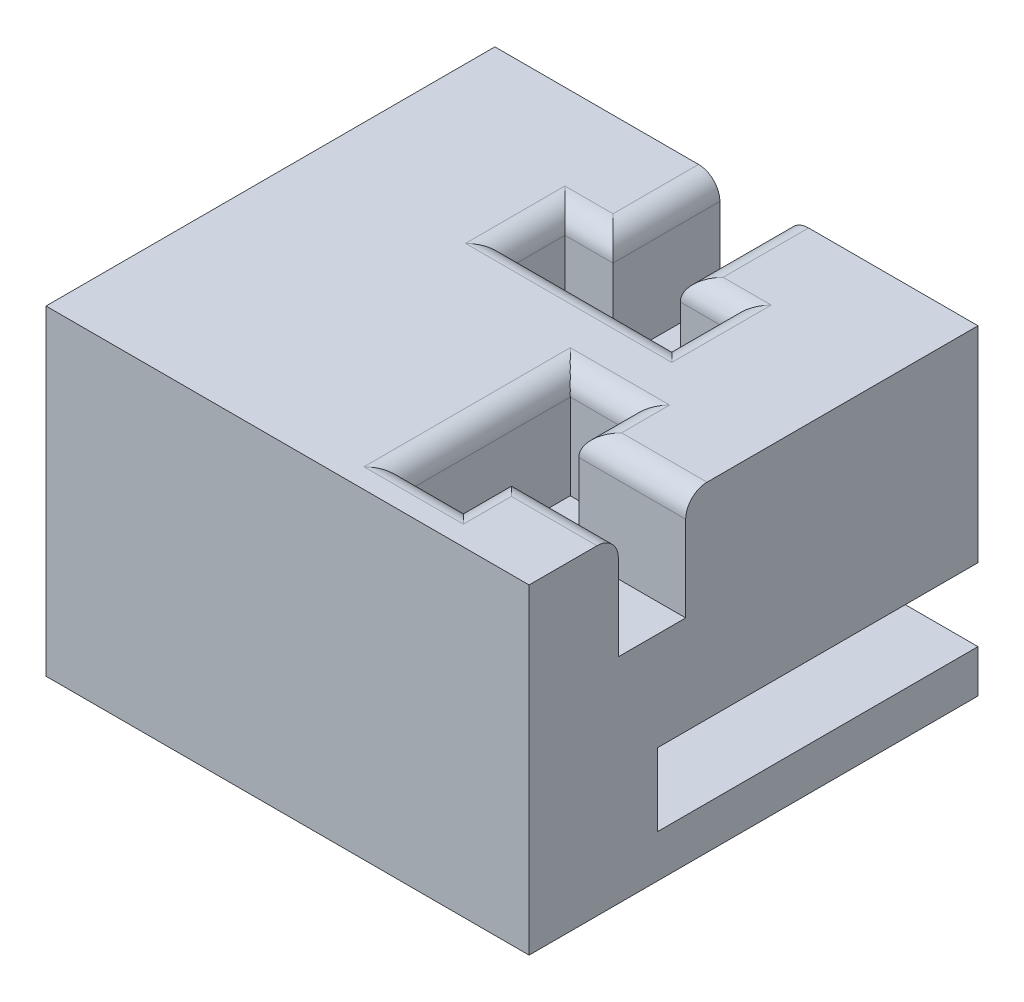
ISO-10303-21;
HEADER;
FILE_DESCRIPTION(('STEP AP214'),'2;1');
FILE_NAME('part.step','',(''),(''),'','','');
FILE_SCHEMA(('AUTOMOTIVE_DESIGN { 1 0 10303 214 1 1 1 1 }'));
ENDSEC;
DATA;
#1=APPLICATION_CONTEXT('core data for automotive mechanical design processes');
#2=APPLICATION_PROTOCOL_DEFINITION('international standard','automotive_design',2000,#1);
#3=PRODUCT_CONTEXT('',#1,'mechanical');
#4=PRODUCT('Part','Part','',(#3));
#5=PRODUCT_RELATED_PRODUCT_CATEGORY('part','',(#4));
#6=PRODUCT_DEFINITION_FORMATION('','',#4);
#7=PRODUCT_DEFINITION_CONTEXT('part definition',#1,'design');
#8=PRODUCT_DEFINITION('design','',#6,#7);
#9=PRODUCT_DEFINITION_SHAPE('','',#8);
#10=(LENGTH_UNIT() NAMED_UNIT(*) SI_UNIT(.MILLI.,.METRE.));
#11=(NAMED_UNIT(*) PLANE_ANGLE_UNIT() SI_UNIT($,.RADIAN.));
#12=(NAMED_UNIT(*) SI_UNIT($,.STERADIAN.) SOLID_ANGLE_UNIT());
#13=UNCERTAINTY_MEASURE_WITH_UNIT(LENGTH_MEASURE(1.E-05),#10,'distance_accuracy_value','');
#14=(GEOMETRIC_REPRESENTATION_CONTEXT(3) GLOBAL_UNCERTAINTY_ASSIGNED_CONTEXT((#13)) GLOBAL_UNIT_ASSIGNED_CONTEXT((#10,
#11,#12)) REPRESENTATION_CONTEXT('',''));
#15=CARTESIAN_POINT('',(0.,0.,0.));
#16=DIRECTION('',(0.,0.,1.));
#17=DIRECTION('',(1.,0.,0.));
#18=AXIS2_PLACEMENT_3D('',#15,#16,#17);
#19=CARTESIAN_POINT('',(-32.5,15.,-10.5));
#20=DIRECTION('',(0.,0.,1.));
#21=DIRECTION('',(-1.,0.,0.));
#22=AXIS2_PLACEMENT_3D('',#19,#20,#21);
#23=PLANE('',#22);
#24=DIRECTION('',(1.,0.,0.));
#25=VECTOR('',#24,1.);
#26=CARTESIAN_POINT('',(-32.5,0.,-10.5));
#27=LINE('',#26,#25);
#28=CARTESIAN_POINT('',(-55.1,0.,-10.5));
#29=VERTEX_POINT('',#28);
#30=CARTESIAN_POINT('',(-32.5,0.,-10.5));
#31=VERTEX_POINT('',#30);
#32=EDGE_CURVE('E280',#29,#31,#27,.T.);
#33=ORIENTED_EDGE('',*,*,#32,.F.);
#34=DIRECTION('',(0.,-1.,0.));
#35=VECTOR('',#34,1.);
#36=CARTESIAN_POINT('',(-55.1,0.,-10.5));
#37=LINE('',#36,#35);
#38=CARTESIAN_POINT('',(-55.1,2.,-10.5));
#39=VERTEX_POINT('',#38);
#40=EDGE_CURVE('E256',#39,#29,#37,.T.);
#41=ORIENTED_EDGE('',*,*,#40,.F.);
#42=DIRECTION('',(1.,0.,0.));
#43=VECTOR('',#42,1.);
#44=CARTESIAN_POINT('',(-72.8805071437843,2.,-10.5));
#45=LINE('',#44,#43);
#46=CARTESIAN_POINT('',(-32.5,2.,-10.5));
#47=VERTEX_POINT('',#46);
#48=EDGE_CURVE('E491',#39,#47,#45,.T.);
#49=ORIENTED_EDGE('',*,*,#48,.T.);
#50=DIRECTION('',(0.,-1.,0.));
#51=VECTOR('',#50,1.);
#52=CARTESIAN_POINT('',(-32.5,15.,-10.5));
#53=LINE('',#52,#51);
#54=EDGE_CURVE('E286',#47,#31,#53,.T.);
#55=ORIENTED_EDGE('',*,*,#54,.T.);
#56=EDGE_LOOP('',(#33,#41,#49,#55));
#57=FACE_BOUND('',#56,.T.);
#58=ADVANCED_FACE('F41',(#57),#23,.F.);
#59=DIRECTION('',(1.,0.,0.));
#60=VECTOR('',#59,1.);
#61=CARTESIAN_POINT('',(-72.8805071437843,5.4,-10.5));
#62=LINE('',#61,#60);
#63=CARTESIAN_POINT('',(-55.1,5.4,-10.5));
#64=VERTEX_POINT('',#63);
#65=CARTESIAN_POINT('',(-32.5,5.4,-10.5));
#66=VERTEX_POINT('',#65);
#67=EDGE_CURVE('E479',#64,#66,#62,.T.);
#68=ORIENTED_EDGE('',*,*,#67,.F.);
#69=CARTESIAN_POINT('',(-55.1,15.,-10.5));
#70=VERTEX_POINT('',#69);
#71=EDGE_CURVE('E269',#70,#64,#37,.T.);
#72=ORIENTED_EDGE('',*,*,#71,.F.);
#73=DIRECTION('',(1.,0.,0.));
#74=VECTOR('',#73,1.);
#75=CARTESIAN_POINT('',(-32.5,15.,-10.5));
#76=LINE('',#75,#74);
#77=CARTESIAN_POINT('',(-45.575,15.,-10.5));
#78=VERTEX_POINT('',#77);
#79=EDGE_CURVE('E278',#70,#78,#76,.T.);
#80=ORIENTED_EDGE('',*,*,#79,.T.);
#81=CARTESIAN_POINT('',(-45.575,14.,-10.5));
#82=DIRECTION('',(0.,0.,-1.));
#83=DIRECTION('',(-1.,0.,0.));
#84=AXIS2_PLACEMENT_3D('',#81,#82,#83);
#85=CIRCLE('',#84,1.);
#86=CARTESIAN_POINT('',(-44.575,14.,-10.5));
#87=VERTEX_POINT('',#86);
#88=EDGE_CURVE('E331',#87,#78,#85,.F.);
#89=ORIENTED_EDGE('',*,*,#88,.F.);
#90=DIRECTION('',(0.,1.,0.));
#91=VECTOR('',#90,1.);
#92=CARTESIAN_POINT('',(-44.575,10.,-10.5));
#93=LINE('',#92,#91);
#94=CARTESIAN_POINT('',(-44.575,10.,-10.5));
#95=VERTEX_POINT('',#94);
#96=EDGE_CURVE('E386',#95,#87,#93,.T.);
#97=ORIENTED_EDGE('',*,*,#96,.F.);
#98=DIRECTION('',(1.,0.,0.));
#99=VECTOR('',#98,1.);
#100=CARTESIAN_POINT('',(-44.575,10.,-10.5));
#101=LINE('',#100,#99);
#102=CARTESIAN_POINT('',(-41.425,10.,-10.5));
#103=VERTEX_POINT('',#102);
#104=EDGE_CURVE('E472',#95,#103,#101,.T.);
#105=ORIENTED_EDGE('',*,*,#104,.T.);
#106=DIRECTION('',(0.,1.,0.));
#107=VECTOR('',#106,1.);
#108=CARTESIAN_POINT('',(-41.425,10.,-10.5));
#109=LINE('',#108,#107);
#110=CARTESIAN_POINT('',(-41.425,14.,-10.5));
#111=VERTEX_POINT('',#110);
#112=EDGE_CURVE('E435',#103,#111,#109,.T.);
#113=ORIENTED_EDGE('',*,*,#112,.T.);
#114=CARTESIAN_POINT('',(-40.425,14.,-10.5));
#115=DIRECTION('',(0.,0.,-1.));
#116=DIRECTION('',(-1.,0.,0.));
#117=AXIS2_PLACEMENT_3D('',#114,#115,#116);
#118=CIRCLE('',#117,1.);
#119=CARTESIAN_POINT('',(-40.425,15.,-10.5));
#120=VERTEX_POINT('',#119);
#121=EDGE_CURVE('E334',#120,#111,#118,.F.);
#122=ORIENTED_EDGE('',*,*,#121,.F.);
#123=CARTESIAN_POINT('',(-32.5,15.,-10.5));
#124=VERTEX_POINT('',#123);
#125=EDGE_CURVE('E275',#120,#124,#76,.T.);
#126=ORIENTED_EDGE('',*,*,#125,.T.);
#127=EDGE_CURVE('E287',#124,#66,#53,.T.);
#128=ORIENTED_EDGE('',*,*,#127,.T.);
#129=EDGE_LOOP('',(#68,#72,#80,#89,#97,#105,#113,#122,#126,#128));
#130=FACE_BOUND('',#129,.T.);
#131=ADVANCED_FACE('F523',(#130),#23,.F.);
#132=CARTESIAN_POINT('',(-32.5,15.,-10.5));
#133=DIRECTION('',(-1.,0.,0.));
#134=DIRECTION('',(0.,0.,-1.));
#135=AXIS2_PLACEMENT_3D('',#132,#133,#134);
#136=PLANE('',#135);
#137=DIRECTION('',(0.,1.,0.));
#138=VECTOR('',#137,1.);
#139=CARTESIAN_POINT('',(-32.5,10.,3.175));
#140=LINE('',#139,#138);
#141=CARTESIAN_POINT('',(-32.5,10.,3.175));
#142=VERTEX_POINT('',#141);
#143=CARTESIAN_POINT('',(-32.5,14.,3.175));
#144=VERTEX_POINT('',#143);
#145=EDGE_CURVE('E419',#142,#144,#140,.T.);
#146=ORIENTED_EDGE('',*,*,#145,.F.);
#147=DIRECTION('',(0.,0.,1.));
#148=VECTOR('',#147,1.);
#149=CARTESIAN_POINT('',(-32.5,10.,6.325));
#150=LINE('',#149,#148);
#151=CARTESIAN_POINT('',(-32.5,10.,6.325));
#152=VERTEX_POINT('',#151);
#153=EDGE_CURVE('E416',#142,#152,#150,.T.);
#154=ORIENTED_EDGE('',*,*,#153,.T.);
#155=DIRECTION('',(0.,1.,0.));
#156=VECTOR('',#155,1.);
#157=CARTESIAN_POINT('',(-32.5,10.,6.325));
#158=LINE('',#157,#156);
#159=CARTESIAN_POINT('',(-32.5,14.,6.325));
#160=VERTEX_POINT('',#159);
#161=EDGE_CURVE('E414',#152,#160,#158,.T.);
#162=ORIENTED_EDGE('',*,*,#161,.T.);
#163=CARTESIAN_POINT('',(-32.5,14.,7.325));
#164=DIRECTION('',(1.,0.,0.));
#165=DIRECTION('',(0.,0.,-1.));
#166=AXIS2_PLACEMENT_3D('',#163,#164,#165);
#167=CIRCLE('',#166,1.);
#168=CARTESIAN_POINT('',(-32.5,15.,7.32499999999999));
#169=VERTEX_POINT('',#168);
#170=EDGE_CURVE('E356',#169,#160,#167,.F.);
#171=ORIENTED_EDGE('',*,*,#170,.F.);
#172=DIRECTION('',(0.,0.,1.));
#173=VECTOR('',#172,1.);
#174=CARTESIAN_POINT('',(-32.5,15.,-10.5));
#175=LINE('',#174,#173);
#176=CARTESIAN_POINT('',(-32.5,15.,10.5));
#177=VERTEX_POINT('',#176);
#178=EDGE_CURVE('E404',#169,#177,#175,.T.);
#179=ORIENTED_EDGE('',*,*,#178,.T.);
#180=DIRECTION('',(0.,-1.,0.));
#181=VECTOR('',#180,1.);
#182=CARTESIAN_POINT('',(-32.5,15.,10.5));
#183=LINE('',#182,#181);
#184=CARTESIAN_POINT('',(-32.5,0.,10.5));
#185=VERTEX_POINT('',#184);
#186=EDGE_CURVE('E284',#177,#185,#183,.T.);
#187=ORIENTED_EDGE('',*,*,#186,.T.);
#188=DIRECTION('',(0.,0.,1.));
#189=VECTOR('',#188,1.);
#190=CARTESIAN_POINT('',(-32.5,0.,-10.5));
#191=LINE('',#190,#189);
#192=EDGE_CURVE('E273',#31,#185,#191,.T.);
#193=ORIENTED_EDGE('',*,*,#192,.F.);
#194=ORIENTED_EDGE('',*,*,#54,.F.);
#195=DIRECTION('',(0.,0.,1.));
#196=VECTOR('',#195,1.);
#197=CARTESIAN_POINT('',(-32.5,2.,-10.5));
#198=LINE('',#197,#196);
#199=CARTESIAN_POINT('',(-32.5,2.,4.5));
#200=VERTEX_POINT('',#199);
#201=EDGE_CURVE('E482',#47,#200,#198,.T.);
#202=ORIENTED_EDGE('',*,*,#201,.T.);
#203=DIRECTION('',(0.,1.,0.));
#204=VECTOR('',#203,1.);
#205=CARTESIAN_POINT('',(-32.5,2.,4.5));
#206=LINE('',#205,#204);
#207=CARTESIAN_POINT('',(-32.5,5.4,4.5));
#208=VERTEX_POINT('',#207);
#209=EDGE_CURVE('E485',#200,#208,#206,.T.);
#210=ORIENTED_EDGE('',*,*,#209,.T.);
#211=DIRECTION('',(0.,0.,-1.));
#212=VECTOR('',#211,1.);
#213=CARTESIAN_POINT('',(-32.5,5.4,-10.5));
#214=LINE('',#213,#212);
#215=EDGE_CURVE('E489',#208,#66,#214,.T.);
#216=ORIENTED_EDGE('',*,*,#215,.T.);
#217=ORIENTED_EDGE('',*,*,#127,.F.);
#218=CARTESIAN_POINT('',(-32.5,15.,2.175));
#219=VERTEX_POINT('',#218);
#220=EDGE_CURVE('E407',#124,#219,#175,.T.);
#221=ORIENTED_EDGE('',*,*,#220,.T.);
#222=CARTESIAN_POINT('',(-32.5,14.,2.175));
#223=DIRECTION('',(1.,0.,0.));
#224=DIRECTION('',(0.,0.,-1.));
#225=AXIS2_PLACEMENT_3D('',#222,#223,#224);
#226=CIRCLE('',#225,1.);
#227=EDGE_CURVE('E359',#144,#219,#226,.F.);
#228=ORIENTED_EDGE('',*,*,#227,.F.);
#229=EDGE_LOOP('',(#146,#154,#162,#171,#179,#187,#193,#194,#202,#210,#216,#217,#221,#228));
#230=FACE_BOUND('',#229,.T.);
#231=ADVANCED_FACE('F411',(#230),#136,.F.);
#232=CARTESIAN_POINT('',(-32.5,15.,10.5));
#233=DIRECTION('',(0.,0.,-1.));
#234=DIRECTION('',(1.,0.,0.));
#235=AXIS2_PLACEMENT_3D('',#232,#233,#234);
#236=PLANE('',#235);
#237=DIRECTION('',(-1.,0.,0.));
#238=VECTOR('',#237,1.);
#239=CARTESIAN_POINT('',(-32.5,15.,10.5));
#240=LINE('',#239,#238);
#241=CARTESIAN_POINT('',(-55.1,15.,10.5));
#242=VERTEX_POINT('',#241);
#243=EDGE_CURVE('E268',#177,#242,#240,.T.);
#244=ORIENTED_EDGE('',*,*,#243,.T.);
#245=DIRECTION('',(0.,-1.,0.));
#246=VECTOR('',#245,1.);
#247=CARTESIAN_POINT('',(-55.1,0.,10.5));
#248=LINE('',#247,#246);
#249=CARTESIAN_POINT('',(-55.1,0.,10.5));
#250=VERTEX_POINT('',#249);
#251=EDGE_CURVE('E253',#242,#250,#248,.T.);
#252=ORIENTED_EDGE('',*,*,#251,.T.);
#253=DIRECTION('',(-1.,0.,0.));
#254=VECTOR('',#253,1.);
#255=CARTESIAN_POINT('',(-32.5,0.,10.5));
#256=LINE('',#255,#254);
#257=EDGE_CURVE('E266',#185,#250,#256,.T.);
#258=ORIENTED_EDGE('',*,*,#257,.F.);
#259=ORIENTED_EDGE('',*,*,#186,.F.);
#260=EDGE_LOOP('',(#244,#252,#258,#259));
#261=FACE_BOUND('',#260,.T.);
#262=ADVANCED_FACE('F264',(#261),#236,.F.);
#263=CARTESIAN_POINT('',(-45.,15.,0.));
#264=DIRECTION('',(0.,1.,0.));
#265=DIRECTION('',(0.,0.,1.));
#266=AXIS2_PLACEMENT_3D('',#263,#264,#265);
#267=PLANE('',#266);
#268=DIRECTION('',(0.,0.,-1.));
#269=VECTOR('',#268,1.);
#270=CARTESIAN_POINT('',(-55.1,15.,10.5));
#271=LINE('',#270,#269);
#272=EDGE_CURVE('E260',#242,#70,#271,.T.);
#273=ORIENTED_EDGE('',*,*,#272,.F.);
#274=ORIENTED_EDGE('',*,*,#243,.F.);
#275=ORIENTED_EDGE('',*,*,#178,.F.);
#276=DIRECTION('',(-1.,0.,0.));
#277=VECTOR('',#276,1.);
#278=CARTESIAN_POINT('',(-32.5,15.,7.325));
#279=LINE('',#278,#277);
#280=CARTESIAN_POINT('',(-36.5,15.,7.325));
#281=VERTEX_POINT('',#280);
#282=EDGE_CURVE('E293',#281,#169,#279,.F.);
#283=ORIENTED_EDGE('',*,*,#282,.F.);
#284=DIRECTION('',(0.,0.,1.));
#285=VECTOR('',#284,1.);
#286=CARTESIAN_POINT('',(-36.5,15.,6.325));
#287=LINE('',#286,#285);
#288=CARTESIAN_POINT('',(-36.5,15.,9.575));
#289=VERTEX_POINT('',#288);
#290=EDGE_CURVE('E295',#289,#281,#287,.F.);
#291=ORIENTED_EDGE('',*,*,#290,.F.);
#292=DIRECTION('',(-1.,0.,0.));
#293=VECTOR('',#292,1.);
#294=CARTESIAN_POINT('',(-37.5,15.,9.575));
#295=LINE('',#294,#293);
#296=CARTESIAN_POINT('',(-41.15,15.,9.575));
#297=VERTEX_POINT('',#296);
#298=EDGE_CURVE('E297',#297,#289,#295,.F.);
#299=ORIENTED_EDGE('',*,*,#298,.F.);
#300=DIRECTION('',(0.,0.,-1.));
#301=VECTOR('',#300,1.);
#302=CARTESIAN_POINT('',(-41.15,15.,8.575));
#303=LINE('',#302,#301);
#304=CARTESIAN_POINT('',(-41.15,15.,-0.0749999999999995));
#305=VERTEX_POINT('',#304);
#306=EDGE_CURVE('E299',#305,#297,#303,.F.);
#307=ORIENTED_EDGE('',*,*,#306,.F.);
#308=DIRECTION('',(1.,0.,0.));
#309=VECTOR('',#308,1.);
#310=CARTESIAN_POINT('',(-40.15,15.,-0.0749999999999995));
#311=LINE('',#310,#309);
#312=CARTESIAN_POINT('',(-36.5,15.,-0.0749999999999995));
#313=VERTEX_POINT('',#312);
#314=EDGE_CURVE('E302',#313,#305,#311,.F.);
#315=ORIENTED_EDGE('',*,*,#314,.F.);
#316=DIRECTION('',(0.,0.,1.));
#317=VECTOR('',#316,1.);
#318=CARTESIAN_POINT('',(-36.5,15.,0.925));
#319=LINE('',#318,#317);
#320=CARTESIAN_POINT('',(-36.5,15.,2.175));
#321=VERTEX_POINT('',#320);
#322=EDGE_CURVE('E305',#321,#313,#319,.F.);
#323=ORIENTED_EDGE('',*,*,#322,.F.);
#324=DIRECTION('',(1.,0.,0.));
#325=VECTOR('',#324,1.);
#326=CARTESIAN_POINT('',(-37.5,15.,2.175));
#327=LINE('',#326,#325);
#328=EDGE_CURVE('E308',#219,#321,#327,.F.);
#329=ORIENTED_EDGE('',*,*,#328,.F.);
#330=ORIENTED_EDGE('',*,*,#220,.F.);
#331=ORIENTED_EDGE('',*,*,#125,.F.);
#332=DIRECTION('',(0.,0.,1.));
#333=VECTOR('',#332,1.);
#334=CARTESIAN_POINT('',(-40.425,15.,-10.5));
#335=LINE('',#334,#333);
#336=CARTESIAN_POINT('',(-40.425,15.,-6.5));
#337=VERTEX_POINT('',#336);
#338=EDGE_CURVE('E329',#337,#120,#335,.F.);
#339=ORIENTED_EDGE('',*,*,#338,.F.);
#340=DIRECTION('',(1.,0.,0.));
#341=VECTOR('',#340,1.);
#342=CARTESIAN_POINT('',(-41.425,15.,-6.5));
#343=LINE('',#342,#341);
#344=CARTESIAN_POINT('',(-38.175,15.,-6.5));
#345=VERTEX_POINT('',#344);
#346=EDGE_CURVE('E326',#345,#337,#343,.F.);
#347=ORIENTED_EDGE('',*,*,#346,.F.);
#348=DIRECTION('',(0.,0.,1.));
#349=VECTOR('',#348,1.);
#350=CARTESIAN_POINT('',(-38.175,15.,-5.5));
#351=LINE('',#350,#349);
#352=CARTESIAN_POINT('',(-38.175,15.,-1.85));
#353=VERTEX_POINT('',#352);
#354=EDGE_CURVE('E323',#353,#345,#351,.F.);
#355=ORIENTED_EDGE('',*,*,#354,.F.);
#356=DIRECTION('',(-1.,0.,0.));
#357=VECTOR('',#356,1.);
#358=CARTESIAN_POINT('',(-39.175,15.,-1.85));
#359=LINE('',#358,#357);
#360=CARTESIAN_POINT('',(-47.825,15.,-1.85));
#361=VERTEX_POINT('',#360);
#362=EDGE_CURVE('E320',#361,#353,#359,.F.);
#363=ORIENTED_EDGE('',*,*,#362,.F.);
#364=DIRECTION('',(0.,0.,-1.));
#365=VECTOR('',#364,1.);
#366=CARTESIAN_POINT('',(-47.825,15.,-2.85));
#367=LINE('',#366,#365);
#368=CARTESIAN_POINT('',(-47.825,15.,-6.5));
#369=VERTEX_POINT('',#368);
#370=EDGE_CURVE('E317',#369,#361,#367,.F.);
#371=ORIENTED_EDGE('',*,*,#370,.F.);
#372=DIRECTION('',(1.,0.,0.));
#373=VECTOR('',#372,1.);
#374=CARTESIAN_POINT('',(-46.825,15.,-6.5));
#375=LINE('',#374,#373);
#376=CARTESIAN_POINT('',(-45.575,15.,-6.5));
#377=VERTEX_POINT('',#376);
#378=EDGE_CURVE('E314',#377,#369,#375,.F.);
#379=ORIENTED_EDGE('',*,*,#378,.F.);
#380=DIRECTION('',(0.,0.,-1.));
#381=VECTOR('',#380,1.);
#382=CARTESIAN_POINT('',(-45.575,15.,-5.5));
#383=LINE('',#382,#381);
#384=EDGE_CURVE('E311',#78,#377,#383,.F.);
#385=ORIENTED_EDGE('',*,*,#384,.F.);
#386=ORIENTED_EDGE('',*,*,#79,.F.);
#387=EDGE_LOOP('',(#273,#274,#275,#283,#291,#299,#307,#315,#323,#329,#330,#331,#339,#347,#355,
#363,#371,#379,#385,#386));
#388=FACE_BOUND('',#387,.T.);
#389=ADVANCED_FACE('F402',(#388),#267,.T.);
#390=CARTESIAN_POINT('',(-45.,0.,0.));
#391=DIRECTION('',(0.,1.,0.));
#392=DIRECTION('',(0.,0.,1.));
#393=AXIS2_PLACEMENT_3D('',#390,#391,#392);
#394=PLANE('',#393);
#395=ORIENTED_EDGE('',*,*,#257,.T.);
#396=DIRECTION('',(0.,0.,-1.));
#397=VECTOR('',#396,1.);
#398=CARTESIAN_POINT('',(-55.1,0.,10.5));
#399=LINE('',#398,#397);
#400=EDGE_CURVE('E250',#250,#29,#399,.T.);
#401=ORIENTED_EDGE('',*,*,#400,.T.);
#402=ORIENTED_EDGE('',*,*,#32,.T.);
#403=ORIENTED_EDGE('',*,*,#192,.T.);
#404=EDGE_LOOP('',(#395,#401,#402,#403));
#405=FACE_BOUND('',#404,.T.);
#406=ADVANCED_FACE('F271',(#405),#394,.F.);
#407=CARTESIAN_POINT('',(-72.8805071437843,5.4,-10.5));
#408=DIRECTION('',(0.,1.,0.));
#409=DIRECTION('',(0.,0.,1.));
#410=AXIS2_PLACEMENT_3D('',#407,#408,#409);
#411=PLANE('',#410);
#412=DIRECTION('',(0.,0.,1.));
#413=VECTOR('',#412,1.);
#414=CARTESIAN_POINT('',(-55.1,5.4,-10.5));
#415=LINE('',#414,#413);
#416=CARTESIAN_POINT('',(-55.1,5.4,4.5));
#417=VERTEX_POINT('',#416);
#418=EDGE_CURVE('E478',#64,#417,#415,.T.);
#419=ORIENTED_EDGE('',*,*,#418,.F.);
#420=ORIENTED_EDGE('',*,*,#67,.T.);
#421=ORIENTED_EDGE('',*,*,#215,.F.);
#422=DIRECTION('',(1.,0.,0.));
#423=VECTOR('',#422,1.);
#424=CARTESIAN_POINT('',(-72.8805071437843,5.4,4.5));
#425=LINE('',#424,#423);
#426=EDGE_CURVE('E494',#417,#208,#425,.T.);
#427=ORIENTED_EDGE('',*,*,#426,.F.);
#428=EDGE_LOOP('',(#419,#420,#421,#427));
#429=FACE_BOUND('',#428,.T.);
#430=ADVANCED_FACE('F519',(#429),#411,.F.);
#431=CARTESIAN_POINT('',(-72.8805071437843,2.,4.5));
#432=DIRECTION('',(0.,0.,1.));
#433=DIRECTION('',(0.,-1.,0.));
#434=AXIS2_PLACEMENT_3D('',#431,#432,#433);
#435=PLANE('',#434);
#436=DIRECTION('',(0.,-1.,0.));
#437=VECTOR('',#436,1.);
#438=CARTESIAN_POINT('',(-55.1,2.,4.5));
#439=LINE('',#438,#437);
#440=CARTESIAN_POINT('',(-55.1,2.,4.5));
#441=VERTEX_POINT('',#440);
#442=EDGE_CURVE('E476',#417,#441,#439,.T.);
#443=ORIENTED_EDGE('',*,*,#442,.F.);
#444=ORIENTED_EDGE('',*,*,#426,.T.);
#445=ORIENTED_EDGE('',*,*,#209,.F.);
#446=DIRECTION('',(1.,0.,0.));
#447=VECTOR('',#446,1.);
#448=CARTESIAN_POINT('',(-72.8805071437843,2.,4.5));
#449=LINE('',#448,#447);
#450=EDGE_CURVE('E496',#441,#200,#449,.T.);
#451=ORIENTED_EDGE('',*,*,#450,.F.);
#452=EDGE_LOOP('',(#443,#444,#445,#451));
#453=FACE_BOUND('',#452,.T.);
#454=ADVANCED_FACE('F515',(#453),#435,.F.);
#455=CARTESIAN_POINT('',(-72.8805071437843,2.,-10.5));
#456=DIRECTION('',(0.,-1.,0.));
#457=DIRECTION('',(0.,0.,-1.));
#458=AXIS2_PLACEMENT_3D('',#455,#456,#457);
#459=PLANE('',#458);
#460=DIRECTION('',(0.,0.,-1.));
#461=VECTOR('',#460,1.);
#462=CARTESIAN_POINT('',(-55.1,2.,-10.5));
#463=LINE('',#462,#461);
#464=EDGE_CURVE('E481',#441,#39,#463,.T.);
#465=ORIENTED_EDGE('',*,*,#464,.F.);
#466=ORIENTED_EDGE('',*,*,#450,.T.);
#467=ORIENTED_EDGE('',*,*,#201,.F.);
#468=ORIENTED_EDGE('',*,*,#48,.F.);
#469=EDGE_LOOP('',(#465,#466,#467,#468));
#470=FACE_BOUND('',#469,.T.);
#471=ADVANCED_FACE('F508',(#470),#459,.F.);
#472=CARTESIAN_POINT('',(-44.575,10.,-5.5));
#473=DIRECTION('',(-1.,0.,0.));
#474=DIRECTION('',(0.,0.,-1.));
#475=AXIS2_PLACEMENT_3D('',#472,#473,#474);
#476=PLANE('',#475);
#477=DIRECTION('',(0.,1.,0.));
#478=VECTOR('',#477,1.);
#479=CARTESIAN_POINT('',(-44.575,10.,-5.5));
#480=LINE('',#479,#478);
#481=CARTESIAN_POINT('',(-44.575,10.,-5.5));
#482=VERTEX_POINT('',#481);
#483=CARTESIAN_POINT('',(-44.575,14.,-5.5));
#484=VERTEX_POINT('',#483);
#485=EDGE_CURVE('E454',#482,#484,#480,.T.);
#486=ORIENTED_EDGE('',*,*,#485,.F.);
#487=DIRECTION('',(0.,0.,-1.));
#488=VECTOR('',#487,1.);
#489=CARTESIAN_POINT('',(-44.575,10.,-5.5));
#490=LINE('',#489,#488);
#491=EDGE_CURVE('E438',#482,#95,#490,.T.);
#492=ORIENTED_EDGE('',*,*,#491,.T.);
#493=ORIENTED_EDGE('',*,*,#96,.T.);
#494=DIRECTION('',(0.,0.,-1.));
#495=VECTOR('',#494,1.);
#496=CARTESIAN_POINT('',(-44.575,14.,-10.5));
#497=LINE('',#496,#495);
#498=EDGE_CURVE('E352',#484,#87,#497,.T.);
#499=ORIENTED_EDGE('',*,*,#498,.F.);
#500=EDGE_LOOP('',(#486,#492,#493,#499));
#501=FACE_BOUND('',#500,.T.);
#502=ADVANCED_FACE('F650',(#501),#476,.F.);
#503=CARTESIAN_POINT('',(-46.825,10.,-5.5));
#504=DIRECTION('',(0.,0.,-1.));
#505=DIRECTION('',(1.,0.,0.));
#506=AXIS2_PLACEMENT_3D('',#503,#504,#505);
#507=PLANE('',#506);
#508=DIRECTION('',(0.,1.,0.));
#509=VECTOR('',#508,1.);
#510=CARTESIAN_POINT('',(-46.825,10.,-5.5));
#511=LINE('',#510,#509);
#512=CARTESIAN_POINT('',(-46.825,10.,-5.5));
#513=VERTEX_POINT('',#512);
#514=CARTESIAN_POINT('',(-46.825,14.,-5.5));
#515=VERTEX_POINT('',#514);
#516=EDGE_CURVE('E451',#513,#515,#511,.T.);
#517=ORIENTED_EDGE('',*,*,#516,.F.);
#518=DIRECTION('',(1.,0.,0.));
#519=VECTOR('',#518,1.);
#520=CARTESIAN_POINT('',(-46.825,10.,-5.5));
#521=LINE('',#520,#519);
#522=EDGE_CURVE('E460',#513,#482,#521,.T.);
#523=ORIENTED_EDGE('',*,*,#522,.T.);
#524=ORIENTED_EDGE('',*,*,#485,.T.);
#525=DIRECTION('',(1.,0.,0.));
#526=VECTOR('',#525,1.);
#527=CARTESIAN_POINT('',(-44.575,14.,-5.5));
#528=LINE('',#527,#526);
#529=EDGE_CURVE('E349',#515,#484,#528,.T.);
#530=ORIENTED_EDGE('',*,*,#529,.F.);
#531=EDGE_LOOP('',(#517,#523,#524,#530));
#532=FACE_BOUND('',#531,.T.);
#533=ADVANCED_FACE('F651',(#532),#507,.F.);
#534=CARTESIAN_POINT('',(-46.825,10.,-2.85));
#535=DIRECTION('',(-1.,0.,0.));
#536=DIRECTION('',(0.,0.,-1.));
#537=AXIS2_PLACEMENT_3D('',#534,#535,#536);
#538=PLANE('',#537);
#539=DIRECTION('',(0.,1.,0.));
#540=VECTOR('',#539,1.);
#541=CARTESIAN_POINT('',(-46.825,10.,-2.85));
#542=LINE('',#541,#540);
#543=CARTESIAN_POINT('',(-46.825,10.,-2.85));
#544=VERTEX_POINT('',#543);
#545=CARTESIAN_POINT('',(-46.825,14.,-2.85));
#546=VERTEX_POINT('',#545);
#547=EDGE_CURVE('E448',#544,#546,#542,.T.);
#548=ORIENTED_EDGE('',*,*,#547,.F.);
#549=DIRECTION('',(0.,0.,-1.));
#550=VECTOR('',#549,1.);
#551=CARTESIAN_POINT('',(-46.825,10.,-2.85));
#552=LINE('',#551,#550);
#553=EDGE_CURVE('E462',#544,#513,#552,.T.);
#554=ORIENTED_EDGE('',*,*,#553,.T.);
#555=ORIENTED_EDGE('',*,*,#516,.T.);
#556=DIRECTION('',(0.,0.,-1.));
#557=VECTOR('',#556,1.);
#558=CARTESIAN_POINT('',(-46.825,14.,-5.5));
#559=LINE('',#558,#557);
#560=EDGE_CURVE('E346',#546,#515,#559,.T.);
#561=ORIENTED_EDGE('',*,*,#560,.F.);
#562=EDGE_LOOP('',(#548,#554,#555,#561));
#563=FACE_BOUND('',#562,.T.);
#564=ADVANCED_FACE('F671',(#563),#538,.F.);
#565=CARTESIAN_POINT('',(-39.175,10.,-2.85));
#566=DIRECTION('',(0.,0.,1.));
#567=DIRECTION('',(-1.,0.,0.));
#568=AXIS2_PLACEMENT_3D('',#565,#566,#567);
#569=PLANE('',#568);
#570=DIRECTION('',(0.,1.,0.));
#571=VECTOR('',#570,1.);
#572=CARTESIAN_POINT('',(-39.175,10.,-2.85));
#573=LINE('',#572,#571);
#574=CARTESIAN_POINT('',(-39.175,10.,-2.85));
#575=VERTEX_POINT('',#574);
#576=CARTESIAN_POINT('',(-39.175,14.,-2.85));
#577=VERTEX_POINT('',#576);
#578=EDGE_CURVE('E445',#575,#577,#573,.T.);
#579=ORIENTED_EDGE('',*,*,#578,.F.);
#580=DIRECTION('',(-1.,0.,0.));
#581=VECTOR('',#580,1.);
#582=CARTESIAN_POINT('',(-39.175,10.,-2.85));
#583=LINE('',#582,#581);
#584=EDGE_CURVE('E464',#575,#544,#583,.T.);
#585=ORIENTED_EDGE('',*,*,#584,.T.);
#586=ORIENTED_EDGE('',*,*,#547,.T.);
#587=DIRECTION('',(-1.,0.,0.));
#588=VECTOR('',#587,1.);
#589=CARTESIAN_POINT('',(-46.825,14.,-2.85));
#590=LINE('',#589,#588);
#591=EDGE_CURVE('E343',#577,#546,#590,.T.);
#592=ORIENTED_EDGE('',*,*,#591,.F.);
#593=EDGE_LOOP('',(#579,#585,#586,#592));
#594=FACE_BOUND('',#593,.T.);
#595=ADVANCED_FACE('F674',(#594),#569,.F.);
#596=CARTESIAN_POINT('',(-39.175,10.,-5.5));
#597=DIRECTION('',(1.,0.,0.));
#598=DIRECTION('',(0.,0.,1.));
#599=AXIS2_PLACEMENT_3D('',#596,#597,#598);
#600=PLANE('',#599);
#601=DIRECTION('',(0.,1.,0.));
#602=VECTOR('',#601,1.);
#603=CARTESIAN_POINT('',(-39.175,10.,-5.5));
#604=LINE('',#603,#602);
#605=CARTESIAN_POINT('',(-39.175,10.,-5.5));
#606=VERTEX_POINT('',#605);
#607=CARTESIAN_POINT('',(-39.175,14.,-5.5));
#608=VERTEX_POINT('',#607);
#609=EDGE_CURVE('E442',#606,#608,#604,.T.);
#610=ORIENTED_EDGE('',*,*,#609,.F.);
#611=DIRECTION('',(0.,0.,1.));
#612=VECTOR('',#611,1.);
#613=CARTESIAN_POINT('',(-39.175,10.,-5.5));
#614=LINE('',#613,#612);
#615=EDGE_CURVE('E466',#606,#575,#614,.T.);
#616=ORIENTED_EDGE('',*,*,#615,.T.);
#617=ORIENTED_EDGE('',*,*,#578,.T.);
#618=DIRECTION('',(0.,0.,1.));
#619=VECTOR('',#618,1.);
#620=CARTESIAN_POINT('',(-39.175,14.,-2.85));
#621=LINE('',#620,#619);
#622=EDGE_CURVE('E340',#608,#577,#621,.T.);
#623=ORIENTED_EDGE('',*,*,#622,.F.);
#624=EDGE_LOOP('',(#610,#616,#617,#623));
#625=FACE_BOUND('',#624,.T.);
#626=ADVANCED_FACE('F679',(#625),#600,.F.);
#627=CARTESIAN_POINT('',(-41.425,10.,-5.5));
#628=DIRECTION('',(0.,0.,-1.));
#629=DIRECTION('',(1.,0.,0.));
#630=AXIS2_PLACEMENT_3D('',#627,#628,#629);
#631=PLANE('',#630);
#632=DIRECTION('',(0.,1.,0.));
#633=VECTOR('',#632,1.);
#634=CARTESIAN_POINT('',(-41.425,10.,-5.5));
#635=LINE('',#634,#633);
#636=CARTESIAN_POINT('',(-41.425,10.,-5.5));
#637=VERTEX_POINT('',#636);
#638=CARTESIAN_POINT('',(-41.425,14.,-5.5));
#639=VERTEX_POINT('',#638);
#640=EDGE_CURVE('E439',#637,#639,#635,.T.);
#641=ORIENTED_EDGE('',*,*,#640,.F.);
#642=DIRECTION('',(1.,0.,0.));
#643=VECTOR('',#642,1.);
#644=CARTESIAN_POINT('',(-41.425,10.,-5.5));
#645=LINE('',#644,#643);
#646=EDGE_CURVE('E468',#637,#606,#645,.T.);
#647=ORIENTED_EDGE('',*,*,#646,.T.);
#648=ORIENTED_EDGE('',*,*,#609,.T.);
#649=DIRECTION('',(1.,0.,0.));
#650=VECTOR('',#649,1.);
#651=CARTESIAN_POINT('',(-39.175,14.,-5.5));
#652=LINE('',#651,#650);
#653=EDGE_CURVE('E337',#639,#608,#652,.T.);
#654=ORIENTED_EDGE('',*,*,#653,.F.);
#655=EDGE_LOOP('',(#641,#647,#648,#654));
#656=FACE_BOUND('',#655,.T.);
#657=ADVANCED_FACE('F681',(#656),#631,.F.);
#658=CARTESIAN_POINT('',(-41.425,10.,-10.5));
#659=DIRECTION('',(1.,0.,0.));
#660=DIRECTION('',(0.,0.,1.));
#661=AXIS2_PLACEMENT_3D('',#658,#659,#660);
#662=PLANE('',#661);
#663=ORIENTED_EDGE('',*,*,#112,.F.);
#664=DIRECTION('',(0.,0.,1.));
#665=VECTOR('',#664,1.);
#666=CARTESIAN_POINT('',(-41.425,10.,-10.5));
#667=LINE('',#666,#665);
#668=EDGE_CURVE('E470',#103,#637,#667,.T.);
#669=ORIENTED_EDGE('',*,*,#668,.T.);
#670=ORIENTED_EDGE('',*,*,#640,.T.);
#671=DIRECTION('',(0.,0.,1.));
#672=VECTOR('',#671,1.);
#673=CARTESIAN_POINT('',(-41.425,14.,-5.5));
#674=LINE('',#673,#672);
#675=EDGE_CURVE('E290',#111,#639,#674,.T.);
#676=ORIENTED_EDGE('',*,*,#675,.F.);
#677=EDGE_LOOP('',(#663,#669,#670,#676));
#678=FACE_BOUND('',#677,.T.);
#679=ADVANCED_FACE('F661',(#678),#662,.F.);
#680=CARTESIAN_POINT('',(-45.,10.,0.));
#681=DIRECTION('',(0.,1.,0.));
#682=DIRECTION('',(0.,0.,1.));
#683=AXIS2_PLACEMENT_3D('',#680,#681,#682);
#684=PLANE('',#683);
#685=ORIENTED_EDGE('',*,*,#104,.F.);
#686=ORIENTED_EDGE('',*,*,#491,.F.);
#687=ORIENTED_EDGE('',*,*,#522,.F.);
#688=ORIENTED_EDGE('',*,*,#553,.F.);
#689=ORIENTED_EDGE('',*,*,#584,.F.);
#690=ORIENTED_EDGE('',*,*,#615,.F.);
#691=ORIENTED_EDGE('',*,*,#646,.F.);
#692=ORIENTED_EDGE('',*,*,#668,.F.);
#693=EDGE_LOOP('',(#685,#686,#687,#688,#689,#690,#691,#692));
#694=FACE_BOUND('',#693,.T.);
#695=ADVANCED_FACE('F657',(#694),#684,.T.);
#696=CARTESIAN_POINT('',(-37.5,10.,0.925));
#697=DIRECTION('',(0.,0.,-1.));
#698=DIRECTION('',(1.,0.,0.));
#699=AXIS2_PLACEMENT_3D('',#696,#697,#698);
#700=PLANE('',#699);
#701=DIRECTION('',(0.,1.,0.));
#702=VECTOR('',#701,1.);
#703=CARTESIAN_POINT('',(-40.15,10.,0.925));
#704=LINE('',#703,#702);
#705=CARTESIAN_POINT('',(-40.15,10.,0.925));
#706=VERTEX_POINT('',#705);
#707=CARTESIAN_POINT('',(-40.15,14.,0.925));
#708=VERTEX_POINT('',#707);
#709=EDGE_CURVE('E486',#706,#708,#704,.T.);
#710=ORIENTED_EDGE('',*,*,#709,.F.);
#711=DIRECTION('',(1.,0.,0.));
#712=VECTOR('',#711,1.);
#713=CARTESIAN_POINT('',(-37.5,10.,0.925));
#714=LINE('',#713,#712);
#715=CARTESIAN_POINT('',(-37.5,10.,0.925));
#716=VERTEX_POINT('',#715);
#717=EDGE_CURVE('E475',#706,#716,#714,.T.);
#718=ORIENTED_EDGE('',*,*,#717,.T.);
#719=DIRECTION('',(0.,1.,0.));
#720=VECTOR('',#719,1.);
#721=CARTESIAN_POINT('',(-37.5,10.,0.925));
#722=LINE('',#721,#720);
#723=CARTESIAN_POINT('',(-37.5,14.,0.925));
#724=VERTEX_POINT('',#723);
#725=EDGE_CURVE('E431',#716,#724,#722,.T.);
#726=ORIENTED_EDGE('',*,*,#725,.T.);
#727=DIRECTION('',(1.,0.,0.));
#728=VECTOR('',#727,1.);
#729=CARTESIAN_POINT('',(-37.5,14.,0.925));
#730=LINE('',#729,#728);
#731=EDGE_CURVE('E365',#708,#724,#730,.T.);
#732=ORIENTED_EDGE('',*,*,#731,.F.);
#733=EDGE_LOOP('',(#710,#718,#726,#732));
#734=FACE_BOUND('',#733,.T.);
#735=ADVANCED_FACE('F584',(#734),#700,.F.);
#736=CARTESIAN_POINT('',(-40.15,10.,0.925));
#737=DIRECTION('',(-1.,0.,0.));
#738=DIRECTION('',(0.,0.,-1.));
#739=AXIS2_PLACEMENT_3D('',#736,#737,#738);
#740=PLANE('',#739);
#741=DIRECTION('',(0.,1.,0.));
#742=VECTOR('',#741,1.);
#743=CARTESIAN_POINT('',(-40.15,10.,8.575));
#744=LINE('',#743,#742);
#745=CARTESIAN_POINT('',(-40.15,10.,8.575));
#746=VERTEX_POINT('',#745);
#747=CARTESIAN_POINT('',(-40.15,14.,8.575));
#748=VERTEX_POINT('',#747);
#749=EDGE_CURVE('E561',#746,#748,#744,.T.);
#750=ORIENTED_EDGE('',*,*,#749,.F.);
#751=DIRECTION('',(0.,0.,-1.));
#752=VECTOR('',#751,1.);
#753=CARTESIAN_POINT('',(-40.15,10.,0.925));
#754=LINE('',#753,#752);
#755=EDGE_CURVE('E434',#746,#706,#754,.T.);
#756=ORIENTED_EDGE('',*,*,#755,.T.);
#757=ORIENTED_EDGE('',*,*,#709,.T.);
#758=DIRECTION('',(0.,0.,-1.));
#759=VECTOR('',#758,1.);
#760=CARTESIAN_POINT('',(-40.15,14.,0.925));
#761=LINE('',#760,#759);
#762=EDGE_CURVE('E368',#748,#708,#761,.T.);
#763=ORIENTED_EDGE('',*,*,#762,.F.);
#764=EDGE_LOOP('',(#750,#756,#757,#763));
#765=FACE_BOUND('',#764,.T.);
#766=ADVANCED_FACE('F578',(#765),#740,.F.);
#767=CARTESIAN_POINT('',(-40.15,10.,8.575));
#768=DIRECTION('',(0.,0.,1.));
#769=DIRECTION('',(-1.,0.,0.));
#770=AXIS2_PLACEMENT_3D('',#767,#768,#769);
#771=PLANE('',#770);
#772=DIRECTION('',(0.,1.,0.));
#773=VECTOR('',#772,1.);
#774=CARTESIAN_POINT('',(-37.5,10.,8.575));
#775=LINE('',#774,#773);
#776=CARTESIAN_POINT('',(-37.5,10.,8.575));
#777=VERTEX_POINT('',#776);
#778=CARTESIAN_POINT('',(-37.5,14.,8.575));
#779=VERTEX_POINT('',#778);
#780=EDGE_CURVE('E422',#777,#779,#775,.T.);
#781=ORIENTED_EDGE('',*,*,#780,.F.);
#782=DIRECTION('',(-1.,0.,0.));
#783=VECTOR('',#782,1.);
#784=CARTESIAN_POINT('',(-40.15,10.,8.575));
#785=LINE('',#784,#783);
#786=EDGE_CURVE('E556',#777,#746,#785,.T.);
#787=ORIENTED_EDGE('',*,*,#786,.T.);
#788=ORIENTED_EDGE('',*,*,#749,.T.);
#789=DIRECTION('',(-1.,0.,0.));
#790=VECTOR('',#789,1.);
#791=CARTESIAN_POINT('',(-40.15,14.,8.575));
#792=LINE('',#791,#790);
#793=EDGE_CURVE('E50',#779,#748,#792,.T.);
#794=ORIENTED_EDGE('',*,*,#793,.F.);
#795=EDGE_LOOP('',(#781,#787,#788,#794));
#796=FACE_BOUND('',#795,.T.);
#797=ADVANCED_FACE('F572',(#796),#771,.F.);
#798=CARTESIAN_POINT('',(-37.5,10.,8.575));
#799=DIRECTION('',(1.,0.,0.));
#800=DIRECTION('',(0.,0.,1.));
#801=AXIS2_PLACEMENT_3D('',#798,#799,#800);
#802=PLANE('',#801);
#803=DIRECTION('',(0.,1.,0.));
#804=VECTOR('',#803,1.);
#805=CARTESIAN_POINT('',(-37.5,10.,6.325));
#806=LINE('',#805,#804);
#807=CARTESIAN_POINT('',(-37.5,10.,6.325));
#808=VERTEX_POINT('',#807);
#809=CARTESIAN_POINT('',(-37.5,14.,6.325));
#810=VERTEX_POINT('',#809);
#811=EDGE_CURVE('E418',#808,#810,#806,.T.);
#812=ORIENTED_EDGE('',*,*,#811,.F.);
#813=DIRECTION('',(0.,0.,1.));
#814=VECTOR('',#813,1.);
#815=CARTESIAN_POINT('',(-37.5,10.,8.575));
#816=LINE('',#815,#814);
#817=EDGE_CURVE('E554',#808,#777,#816,.T.);
#818=ORIENTED_EDGE('',*,*,#817,.T.);
#819=ORIENTED_EDGE('',*,*,#780,.T.);
#820=DIRECTION('',(0.,0.,1.));
#821=VECTOR('',#820,1.);
#822=CARTESIAN_POINT('',(-37.5,14.,8.575));
#823=LINE('',#822,#821);
#824=EDGE_CURVE('E371',#810,#779,#823,.T.);
#825=ORIENTED_EDGE('',*,*,#824,.F.);
#826=EDGE_LOOP('',(#812,#818,#819,#825));
#827=FACE_BOUND('',#826,.T.);
#828=ADVANCED_FACE('F567',(#827),#802,.F.);
#829=CARTESIAN_POINT('',(-37.5,10.,6.325));
#830=DIRECTION('',(0.,0.,1.));
#831=DIRECTION('',(-1.,0.,0.));
#832=AXIS2_PLACEMENT_3D('',#829,#830,#831);
#833=PLANE('',#832);
#834=ORIENTED_EDGE('',*,*,#161,.F.);
#835=DIRECTION('',(-1.,0.,0.));
#836=VECTOR('',#835,1.);
#837=CARTESIAN_POINT('',(-37.5,10.,6.325));
#838=LINE('',#837,#836);
#839=EDGE_CURVE('E549',#152,#808,#838,.T.);
#840=ORIENTED_EDGE('',*,*,#839,.T.);
#841=ORIENTED_EDGE('',*,*,#811,.T.);
#842=DIRECTION('',(-1.,0.,0.));
#843=VECTOR('',#842,1.);
#844=CARTESIAN_POINT('',(-37.5,14.,6.325));
#845=LINE('',#844,#843);
#846=EDGE_CURVE('E12',#160,#810,#845,.T.);
#847=ORIENTED_EDGE('',*,*,#846,.F.);
#848=EDGE_LOOP('',(#834,#840,#841,#847));
#849=FACE_BOUND('',#848,.T.);
#850=ADVANCED_FACE('F795',(#849),#833,.F.);
#851=CARTESIAN_POINT('',(-32.5,10.,3.175));
#852=DIRECTION('',(0.,0.,-1.));
#853=DIRECTION('',(1.,0.,0.));
#854=AXIS2_PLACEMENT_3D('',#851,#852,#853);
#855=PLANE('',#854);
#856=DIRECTION('',(0.,1.,0.));
#857=VECTOR('',#856,1.);
#858=CARTESIAN_POINT('',(-37.5,10.,3.175));
#859=LINE('',#858,#857);
#860=CARTESIAN_POINT('',(-37.5,10.,3.175));
#861=VERTEX_POINT('',#860);
#862=CARTESIAN_POINT('',(-37.5,14.,3.175));
#863=VERTEX_POINT('',#862);
#864=EDGE_CURVE('E425',#861,#863,#859,.T.);
#865=ORIENTED_EDGE('',*,*,#864,.F.);
#866=DIRECTION('',(1.,0.,0.));
#867=VECTOR('',#866,1.);
#868=CARTESIAN_POINT('',(-32.5,10.,3.175));
#869=LINE('',#868,#867);
#870=EDGE_CURVE('E545',#861,#142,#869,.T.);
#871=ORIENTED_EDGE('',*,*,#870,.T.);
#872=ORIENTED_EDGE('',*,*,#145,.T.);
#873=DIRECTION('',(1.,0.,0.));
#874=VECTOR('',#873,1.);
#875=CARTESIAN_POINT('',(-32.5,14.,3.175));
#876=LINE('',#875,#874);
#877=EDGE_CURVE('E354',#863,#144,#876,.T.);
#878=ORIENTED_EDGE('',*,*,#877,.F.);
#879=EDGE_LOOP('',(#865,#871,#872,#878));
#880=FACE_BOUND('',#879,.T.);
#881=ADVANCED_FACE('F535',(#880),#855,.F.);
#882=CARTESIAN_POINT('',(-37.5,10.,3.175));
#883=DIRECTION('',(1.,0.,0.));
#884=DIRECTION('',(0.,0.,1.));
#885=AXIS2_PLACEMENT_3D('',#882,#883,#884);
#886=PLANE('',#885);
#887=ORIENTED_EDGE('',*,*,#725,.F.);
#888=DIRECTION('',(0.,0.,1.));
#889=VECTOR('',#888,1.);
#890=CARTESIAN_POINT('',(-37.5,10.,3.175));
#891=LINE('',#890,#889);
#892=EDGE_CURVE('E540',#716,#861,#891,.T.);
#893=ORIENTED_EDGE('',*,*,#892,.T.);
#894=ORIENTED_EDGE('',*,*,#864,.T.);
#895=DIRECTION('',(0.,0.,1.));
#896=VECTOR('',#895,1.);
#897=CARTESIAN_POINT('',(-37.5,14.,3.175));
#898=LINE('',#897,#896);
#899=EDGE_CURVE('E362',#724,#863,#898,.T.);
#900=ORIENTED_EDGE('',*,*,#899,.F.);
#901=EDGE_LOOP('',(#887,#893,#894,#900));
#902=FACE_BOUND('',#901,.T.);
#903=ADVANCED_FACE('F539',(#902),#886,.F.);
#904=CARTESIAN_POINT('',(-45.,10.,0.));
#905=DIRECTION('',(0.,-1.,0.));
#906=DIRECTION('',(0.,0.,-1.));
#907=AXIS2_PLACEMENT_3D('',#904,#905,#906);
#908=PLANE('',#907);
#909=ORIENTED_EDGE('',*,*,#717,.F.);
#910=ORIENTED_EDGE('',*,*,#755,.F.);
#911=ORIENTED_EDGE('',*,*,#786,.F.);
#912=ORIENTED_EDGE('',*,*,#817,.F.);
#913=ORIENTED_EDGE('',*,*,#839,.F.);
#914=ORIENTED_EDGE('',*,*,#153,.F.);
#915=ORIENTED_EDGE('',*,*,#870,.F.);
#916=ORIENTED_EDGE('',*,*,#892,.F.);
#917=EDGE_LOOP('',(#909,#910,#911,#912,#913,#914,#915,#916));
#918=FACE_BOUND('',#917,.T.);
#919=ADVANCED_FACE('F547',(#918),#908,.F.);
#920=CARTESIAN_POINT('',(-45.575,14.,-5.5));
#921=DIRECTION('',(0.,0.,1.));
#922=DIRECTION('',(-1.,0.,0.));
#923=AXIS2_PLACEMENT_3D('',#920,#921,#922);
#924=CYLINDRICAL_SURFACE('',#923,1.);
#925=ORIENTED_EDGE('',*,*,#88,.T.);
#926=ORIENTED_EDGE('',*,*,#384,.T.);
#927=CARTESIAN_POINT('',(-45.575,14.,-6.5));
#928=DIRECTION('',(0.707106781186548,0.,-0.707106781186547));
#929=DIRECTION('',(0.707106781186547,0.,0.707106781186548));
#930=AXIS2_PLACEMENT_3D('',#927,#928,#929);
#931=ELLIPSE('',#930,1.41421356237309,1.);
#932=EDGE_CURVE('E384',#377,#484,#931,.T.);
#933=ORIENTED_EDGE('',*,*,#932,.T.);
#934=ORIENTED_EDGE('',*,*,#498,.T.);
#935=EDGE_LOOP('',(#925,#926,#933,#934));
#936=FACE_BOUND('',#935,.T.);
#937=ADVANCED_FACE('F629',(#936),#924,.T.);
#938=CARTESIAN_POINT('',(-46.825,14.,-6.5));
#939=DIRECTION('',(-1.,0.,0.));
#940=DIRECTION('',(0.,0.,-1.));
#941=AXIS2_PLACEMENT_3D('',#938,#939,#940);
#942=CYLINDRICAL_SURFACE('',#941,1.);
#943=ORIENTED_EDGE('',*,*,#932,.F.);
#944=ORIENTED_EDGE('',*,*,#378,.T.);
#945=CARTESIAN_POINT('',(-47.825,14.,-6.5));
#946=DIRECTION('',(0.707106781186547,0.,-0.707106781186547));
#947=DIRECTION('',(0.707106781186547,0.,0.707106781186547));
#948=AXIS2_PLACEMENT_3D('',#945,#946,#947);
#949=ELLIPSE('',#948,1.41421356237309,1.);
#950=EDGE_CURVE('E382',#369,#515,#949,.T.);
#951=ORIENTED_EDGE('',*,*,#950,.T.);
#952=ORIENTED_EDGE('',*,*,#529,.T.);
#953=EDGE_LOOP('',(#943,#944,#951,#952));
#954=FACE_BOUND('',#953,.T.);
#955=ADVANCED_FACE('F625',(#954),#942,.T.);
#956=CARTESIAN_POINT('',(-47.825,14.,-2.85));
#957=DIRECTION('',(0.,0.,1.));
#958=DIRECTION('',(-1.,0.,0.));
#959=AXIS2_PLACEMENT_3D('',#956,#957,#958);
#960=CYLINDRICAL_SURFACE('',#959,1.);
#961=ORIENTED_EDGE('',*,*,#950,.F.);
#962=ORIENTED_EDGE('',*,*,#370,.T.);
#963=CARTESIAN_POINT('',(-47.825,14.,-1.85));
#964=DIRECTION('',(-0.707106781186547,0.,-0.707106781186548));
#965=DIRECTION('',(0.707106781186548,0.,-0.707106781186547));
#966=AXIS2_PLACEMENT_3D('',#963,#964,#965);
#967=ELLIPSE('',#966,1.41421356237309,1.);
#968=EDGE_CURVE('E380',#361,#546,#967,.T.);
#969=ORIENTED_EDGE('',*,*,#968,.T.);
#970=ORIENTED_EDGE('',*,*,#560,.T.);
#971=EDGE_LOOP('',(#961,#962,#969,#970));
#972=FACE_BOUND('',#971,.T.);
#973=ADVANCED_FACE('F621',(#972),#960,.T.);
#974=CARTESIAN_POINT('',(-39.175,14.,-1.85));
#975=DIRECTION('',(1.,0.,0.));
#976=DIRECTION('',(0.,0.,1.));
#977=AXIS2_PLACEMENT_3D('',#974,#975,#976);
#978=CYLINDRICAL_SURFACE('',#977,1.);
#979=ORIENTED_EDGE('',*,*,#968,.F.);
#980=ORIENTED_EDGE('',*,*,#362,.T.);
#981=CARTESIAN_POINT('',(-38.175,14.,-1.85));
#982=DIRECTION('',(-0.707106781186548,0.,0.707106781186547));
#983=DIRECTION('',(-0.707106781186547,0.,-0.707106781186548));
#984=AXIS2_PLACEMENT_3D('',#981,#982,#983);
#985=ELLIPSE('',#984,1.41421356237309,1.);
#986=EDGE_CURVE('E378',#353,#577,#985,.T.);
#987=ORIENTED_EDGE('',*,*,#986,.T.);
#988=ORIENTED_EDGE('',*,*,#591,.T.);
#989=EDGE_LOOP('',(#979,#980,#987,#988));
#990=FACE_BOUND('',#989,.T.);
#991=ADVANCED_FACE('F617',(#990),#978,.T.);
#992=CARTESIAN_POINT('',(-38.175,14.,-5.5));
#993=DIRECTION('',(0.,0.,-1.));
#994=DIRECTION('',(1.,0.,0.));
#995=AXIS2_PLACEMENT_3D('',#992,#993,#994);
#996=CYLINDRICAL_SURFACE('',#995,1.);
#997=ORIENTED_EDGE('',*,*,#986,.F.);
#998=ORIENTED_EDGE('',*,*,#354,.T.);
#999=CARTESIAN_POINT('',(-38.175,14.,-6.5));
#1000=DIRECTION('',(0.707106781186547,0.,0.707106781186548));
#1001=DIRECTION('',(-0.707106781186548,0.,0.707106781186547));
#1002=AXIS2_PLACEMENT_3D('',#999,#1000,#1001);
#1003=ELLIPSE('',#1002,1.41421356237309,1.);
#1004=EDGE_CURVE('E376',#345,#608,#1003,.T.);
#1005=ORIENTED_EDGE('',*,*,#1004,.T.);
#1006=ORIENTED_EDGE('',*,*,#622,.T.);
#1007=EDGE_LOOP('',(#997,#998,#1005,#1006));
#1008=FACE_BOUND('',#1007,.T.);
#1009=ADVANCED_FACE('F613',(#1008),#996,.T.);
#1010=CARTESIAN_POINT('',(-41.425,14.,-6.5));
#1011=DIRECTION('',(-1.,0.,0.));
#1012=DIRECTION('',(0.,0.,-1.));
#1013=AXIS2_PLACEMENT_3D('',#1010,#1011,#1012);
#1014=CYLINDRICAL_SURFACE('',#1013,1.);
#1015=ORIENTED_EDGE('',*,*,#1004,.F.);
#1016=ORIENTED_EDGE('',*,*,#346,.T.);
#1017=CARTESIAN_POINT('',(-40.425,14.,-6.5));
#1018=DIRECTION('',(0.707106781186547,0.,0.707106781186548));
#1019=DIRECTION('',(-0.707106781186548,0.,0.707106781186547));
#1020=AXIS2_PLACEMENT_3D('',#1017,#1018,#1019);
#1021=ELLIPSE('',#1020,1.41421356237309,1.);
#1022=EDGE_CURVE('E374',#337,#639,#1021,.T.);
#1023=ORIENTED_EDGE('',*,*,#1022,.T.);
#1024=ORIENTED_EDGE('',*,*,#653,.T.);
#1025=EDGE_LOOP('',(#1015,#1016,#1023,#1024));
#1026=FACE_BOUND('',#1025,.T.);
#1027=ADVANCED_FACE('F609',(#1026),#1014,.T.);
#1028=CARTESIAN_POINT('',(-40.425,14.,-10.5));
#1029=DIRECTION('',(0.,0.,-1.));
#1030=DIRECTION('',(1.,0.,0.));
#1031=AXIS2_PLACEMENT_3D('',#1028,#1029,#1030);
#1032=CYLINDRICAL_SURFACE('',#1031,1.);
#1033=ORIENTED_EDGE('',*,*,#121,.T.);
#1034=ORIENTED_EDGE('',*,*,#675,.T.);
#1035=ORIENTED_EDGE('',*,*,#1022,.F.);
#1036=ORIENTED_EDGE('',*,*,#338,.T.);
#1037=EDGE_LOOP('',(#1033,#1034,#1035,#1036));
#1038=FACE_BOUND('',#1037,.T.);
#1039=ADVANCED_FACE('F606',(#1038),#1032,.T.);
#1040=CARTESIAN_POINT('',(-37.5,14.,7.325));
#1041=DIRECTION('',(1.,0.,0.));
#1042=DIRECTION('',(0.,0.,1.));
#1043=AXIS2_PLACEMENT_3D('',#1040,#1041,#1042);
#1044=CYLINDRICAL_SURFACE('',#1043,1.);
#1045=ORIENTED_EDGE('',*,*,#170,.T.);
#1046=ORIENTED_EDGE('',*,*,#846,.T.);
#1047=CARTESIAN_POINT('',(-36.5,14.,7.325));
#1048=DIRECTION('',(-0.707106781186548,0.,0.707106781186547));
#1049=DIRECTION('',(0.707106781186547,0.,0.707106781186548));
#1050=AXIS2_PLACEMENT_3D('',#1047,#1048,#1049);
#1051=ELLIPSE('',#1050,1.4142135623731,1.);
#1052=EDGE_CURVE('E45',#810,#281,#1051,.F.);
#1053=ORIENTED_EDGE('',*,*,#1052,.T.);
#1054=ORIENTED_EDGE('',*,*,#282,.T.);
#1055=EDGE_LOOP('',(#1045,#1046,#1053,#1054));
#1056=FACE_BOUND('',#1055,.T.);
#1057=ADVANCED_FACE('F43',(#1056),#1044,.T.);
#1058=CARTESIAN_POINT('',(-36.5,14.,8.575));
#1059=DIRECTION('',(0.,0.,-1.));
#1060=DIRECTION('',(1.,0.,0.));
#1061=AXIS2_PLACEMENT_3D('',#1058,#1059,#1060);
#1062=CYLINDRICAL_SURFACE('',#1061,1.);
#1063=ORIENTED_EDGE('',*,*,#1052,.F.);
#1064=ORIENTED_EDGE('',*,*,#824,.T.);
#1065=CARTESIAN_POINT('',(-36.5,14.,9.575));
#1066=DIRECTION('',(-0.707106781186547,0.,0.707106781186547));
#1067=DIRECTION('',(-0.707106781186547,0.,-0.707106781186547));
#1068=AXIS2_PLACEMENT_3D('',#1065,#1066,#1067);
#1069=ELLIPSE('',#1068,1.41421356237309,1.);
#1070=EDGE_CURVE('E64',#779,#289,#1069,.F.);
#1071=ORIENTED_EDGE('',*,*,#1070,.T.);
#1072=ORIENTED_EDGE('',*,*,#290,.T.);
#1073=EDGE_LOOP('',(#1063,#1064,#1071,#1072));
#1074=FACE_BOUND('',#1073,.T.);
#1075=ADVANCED_FACE('F399',(#1074),#1062,.T.);
#1076=CARTESIAN_POINT('',(-40.15,14.,9.575));
#1077=DIRECTION('',(1.,0.,0.));
#1078=DIRECTION('',(0.,0.,1.));
#1079=AXIS2_PLACEMENT_3D('',#1076,#1077,#1078);
#1080=CYLINDRICAL_SURFACE('',#1079,1.);
#1081=ORIENTED_EDGE('',*,*,#1070,.F.);
#1082=ORIENTED_EDGE('',*,*,#793,.T.);
#1083=CARTESIAN_POINT('',(-41.15,14.,9.575));
#1084=DIRECTION('',(-0.707106781186547,0.,-0.707106781186547));
#1085=DIRECTION('',(-0.707106781186547,0.,0.707106781186547));
#1086=AXIS2_PLACEMENT_3D('',#1083,#1084,#1085);
#1087=ELLIPSE('',#1086,1.41421356237309,1.);
#1088=EDGE_CURVE('E393',#748,#297,#1087,.F.);
#1089=ORIENTED_EDGE('',*,*,#1088,.T.);
#1090=ORIENTED_EDGE('',*,*,#298,.T.);
#1091=EDGE_LOOP('',(#1081,#1082,#1089,#1090));
#1092=FACE_BOUND('',#1091,.T.);
#1093=ADVANCED_FACE('F576',(#1092),#1080,.T.);
#1094=CARTESIAN_POINT('',(-41.15,14.,0.925));
#1095=DIRECTION('',(0.,0.,1.));
#1096=DIRECTION('',(-1.,0.,0.));
#1097=AXIS2_PLACEMENT_3D('',#1094,#1095,#1096);
#1098=CYLINDRICAL_SURFACE('',#1097,1.);
#1099=ORIENTED_EDGE('',*,*,#1088,.F.);
#1100=ORIENTED_EDGE('',*,*,#762,.T.);
#1101=CARTESIAN_POINT('',(-41.15,14.,-0.0749999999999995));
#1102=DIRECTION('',(0.707106781186547,0.,-0.707106781186547));
#1103=DIRECTION('',(-0.707106781186547,0.,-0.707106781186547));
#1104=AXIS2_PLACEMENT_3D('',#1101,#1102,#1103);
#1105=ELLIPSE('',#1104,1.41421356237309,1.);
#1106=EDGE_CURVE('E391',#708,#305,#1105,.F.);
#1107=ORIENTED_EDGE('',*,*,#1106,.T.);
#1108=ORIENTED_EDGE('',*,*,#306,.T.);
#1109=EDGE_LOOP('',(#1099,#1100,#1107,#1108));
#1110=FACE_BOUND('',#1109,.T.);
#1111=ADVANCED_FACE('F582',(#1110),#1098,.T.);
#1112=CARTESIAN_POINT('',(-37.5,14.,-0.0749999999999995));
#1113=DIRECTION('',(-1.,0.,0.));
#1114=DIRECTION('',(0.,0.,-1.));
#1115=AXIS2_PLACEMENT_3D('',#1112,#1113,#1114);
#1116=CYLINDRICAL_SURFACE('',#1115,1.);
#1117=ORIENTED_EDGE('',*,*,#1106,.F.);
#1118=ORIENTED_EDGE('',*,*,#731,.T.);
#1119=CARTESIAN_POINT('',(-36.5,14.,-0.0749999999999995));
#1120=DIRECTION('',(0.707106781186547,0.,0.707106781186547));
#1121=DIRECTION('',(0.707106781186547,0.,-0.707106781186547));
#1122=AXIS2_PLACEMENT_3D('',#1119,#1120,#1121);
#1123=ELLIPSE('',#1122,1.41421356237309,1.);
#1124=EDGE_CURVE('E389',#724,#313,#1123,.F.);
#1125=ORIENTED_EDGE('',*,*,#1124,.T.);
#1126=ORIENTED_EDGE('',*,*,#314,.T.);
#1127=EDGE_LOOP('',(#1117,#1118,#1125,#1126));
#1128=FACE_BOUND('',#1127,.T.);
#1129=ADVANCED_FACE('F586',(#1128),#1116,.T.);
#1130=CARTESIAN_POINT('',(-36.5,14.,3.175));
#1131=DIRECTION('',(0.,0.,-1.));
#1132=DIRECTION('',(1.,0.,0.));
#1133=AXIS2_PLACEMENT_3D('',#1130,#1131,#1132);
#1134=CYLINDRICAL_SURFACE('',#1133,1.);
#1135=ORIENTED_EDGE('',*,*,#1124,.F.);
#1136=ORIENTED_EDGE('',*,*,#899,.T.);
#1137=CARTESIAN_POINT('',(-36.5,14.,2.175));
#1138=DIRECTION('',(0.707106781186547,0.,0.707106781186547));
#1139=DIRECTION('',(0.707106781186547,0.,-0.707106781186547));
#1140=AXIS2_PLACEMENT_3D('',#1137,#1138,#1139);
#1141=ELLIPSE('',#1140,1.41421356237309,1.);
#1142=EDGE_CURVE('E387',#863,#321,#1141,.F.);
#1143=ORIENTED_EDGE('',*,*,#1142,.T.);
#1144=ORIENTED_EDGE('',*,*,#322,.T.);
#1145=EDGE_LOOP('',(#1135,#1136,#1143,#1144));
#1146=FACE_BOUND('',#1145,.T.);
#1147=ADVANCED_FACE('F589',(#1146),#1134,.T.);
#1148=CARTESIAN_POINT('',(-32.5,14.,2.175));
#1149=DIRECTION('',(-1.,0.,0.));
#1150=DIRECTION('',(0.,0.,-1.));
#1151=AXIS2_PLACEMENT_3D('',#1148,#1149,#1150);
#1152=CYLINDRICAL_SURFACE('',#1151,1.);
#1153=ORIENTED_EDGE('',*,*,#1142,.F.);
#1154=ORIENTED_EDGE('',*,*,#877,.T.);
#1155=ORIENTED_EDGE('',*,*,#227,.T.);
#1156=ORIENTED_EDGE('',*,*,#328,.T.);
#1157=EDGE_LOOP('',(#1153,#1154,#1155,#1156));
#1158=FACE_BOUND('',#1157,.T.);
#1159=ADVANCED_FACE('F531',(#1158),#1152,.T.);
#1160=CARTESIAN_POINT('',(-55.1,0.,10.5));
#1161=DIRECTION('',(1.,0.,0.));
#1162=DIRECTION('',(0.,0.,-1.));
#1163=AXIS2_PLACEMENT_3D('',#1160,#1161,#1162);
#1164=PLANE('',#1163);
#1165=ORIENTED_EDGE('',*,*,#442,.T.);
#1166=ORIENTED_EDGE('',*,*,#464,.T.);
#1167=ORIENTED_EDGE('',*,*,#40,.T.);
#1168=ORIENTED_EDGE('',*,*,#400,.F.);
#1169=ORIENTED_EDGE('',*,*,#251,.F.);
#1170=ORIENTED_EDGE('',*,*,#272,.T.);
#1171=ORIENTED_EDGE('',*,*,#71,.T.);
#1172=ORIENTED_EDGE('',*,*,#418,.T.);
#1173=EDGE_LOOP('',(#1165,#1166,#1167,#1168,#1169,#1170,#1171,#1172));
#1174=FACE_BOUND('',#1173,.T.);
#1175=ADVANCED_FACE('F252',(#1174),#1164,.F.);
#1176=CLOSED_SHELL('',(#58,#131,#231,#262,#389,#406,#430,#454,#471,#502,#533,#564,#595,#626,
#657,#679,#695,#735,#766,#797,#828,#850,#881,#903,#919,#937,#955,#973,#991,#1009,#1027,#1039,
#1057,#1075,#1093,#1111,#1129,#1147,#1159,#1175));
#1177=MANIFOLD_SOLID_BREP('B2',#1176);
#1178=ADVANCED_BREP_SHAPE_REPRESENTATION('',(#18,#1177),#14);
#1179=SHAPE_DEFINITION_REPRESENTATION(#9,#1178);
ENDSEC;
END-ISO-10303-21;
